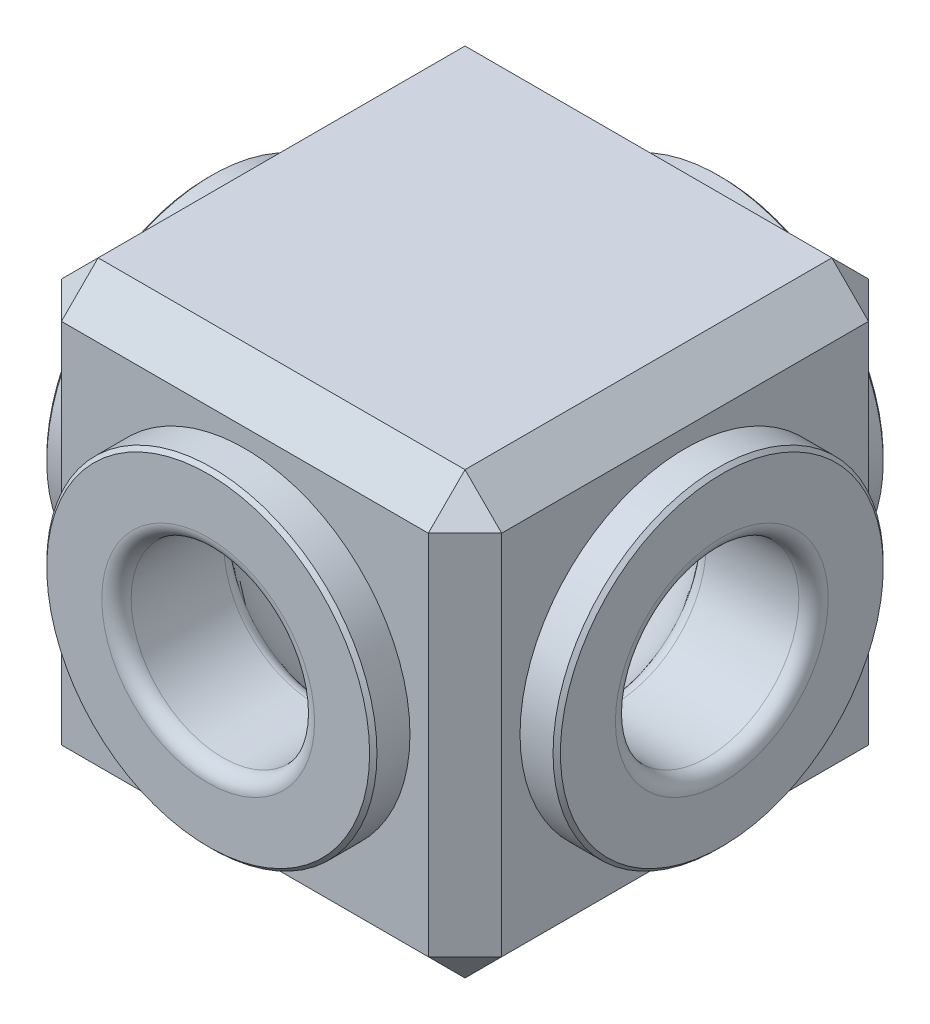
ISO-10303-21;
HEADER;
FILE_DESCRIPTION(('STEP AP214'),'2;1');
FILE_NAME('part.step','',(''),(''),'','','');
FILE_SCHEMA(('AUTOMOTIVE_DESIGN { 1 0 10303 214 1 1 1 1 }'));
ENDSEC;
DATA;
#1=APPLICATION_CONTEXT('core data for automotive mechanical design processes');
#2=APPLICATION_PROTOCOL_DEFINITION('international standard','automotive_design',2000,#1);
#3=PRODUCT_CONTEXT('',#1,'mechanical');
#4=PRODUCT('Part','Part','',(#3));
#5=PRODUCT_RELATED_PRODUCT_CATEGORY('part','',(#4));
#6=PRODUCT_DEFINITION_FORMATION('','',#4);
#7=PRODUCT_DEFINITION_CONTEXT('part definition',#1,'design');
#8=PRODUCT_DEFINITION('design','',#6,#7);
#9=PRODUCT_DEFINITION_SHAPE('','',#8);
#10=(LENGTH_UNIT() NAMED_UNIT(*) SI_UNIT(.MILLI.,.METRE.));
#11=(NAMED_UNIT(*) PLANE_ANGLE_UNIT() SI_UNIT($,.RADIAN.));
#12=(NAMED_UNIT(*) SI_UNIT($,.STERADIAN.) SOLID_ANGLE_UNIT());
#13=UNCERTAINTY_MEASURE_WITH_UNIT(LENGTH_MEASURE(1.E-05),#10,'distance_accuracy_value','');
#14=(GEOMETRIC_REPRESENTATION_CONTEXT(3) GLOBAL_UNCERTAINTY_ASSIGNED_CONTEXT((#13)) GLOBAL_UNIT_ASSIGNED_CONTEXT((#10,
#11,#12)) REPRESENTATION_CONTEXT('',''));
#15=CARTESIAN_POINT('',(0.,0.,0.));
#16=DIRECTION('',(0.,0.,1.));
#17=DIRECTION('',(1.,0.,0.));
#18=AXIS2_PLACEMENT_3D('',#15,#16,#17);
#19=CARTESIAN_POINT('',(30.,30.,30.));
#20=DIRECTION('',(-1.,0.,0.));
#21=DIRECTION('',(0.,0.,1.));
#22=AXIS2_PLACEMENT_3D('',#19,#20,#21);
#23=PLANE('',#22);
#24=DIRECTION('',(0.,-1.,0.));
#25=VECTOR('',#24,1.);
#26=CARTESIAN_POINT('',(30.,30.,25.));
#27=LINE('',#26,#25);
#28=CARTESIAN_POINT('',(30.,25.,25.));
#29=VERTEX_POINT('',#28);
#30=CARTESIAN_POINT('',(30.,-25.,25.));
#31=VERTEX_POINT('',#30);
#32=EDGE_CURVE('E193',#29,#31,#27,.T.);
#33=ORIENTED_EDGE('',*,*,#32,.T.);
#34=DIRECTION('',(0.,0.,-1.));
#35=VECTOR('',#34,1.);
#36=CARTESIAN_POINT('',(30.,-25.,-30.));
#37=LINE('',#36,#35);
#38=CARTESIAN_POINT('',(30.,-25.,-25.));
#39=VERTEX_POINT('',#38);
#40=EDGE_CURVE('E199',#31,#39,#37,.T.);
#41=ORIENTED_EDGE('',*,*,#40,.T.);
#42=DIRECTION('',(0.,1.,0.));
#43=VECTOR('',#42,1.);
#44=CARTESIAN_POINT('',(30.,30.,-25.));
#45=LINE('',#44,#43);
#46=CARTESIAN_POINT('',(30.,25.,-25.));
#47=VERTEX_POINT('',#46);
#48=EDGE_CURVE('E197',#39,#47,#45,.T.);
#49=ORIENTED_EDGE('',*,*,#48,.T.);
#50=DIRECTION('',(0.,0.,1.));
#51=VECTOR('',#50,1.);
#52=CARTESIAN_POINT('',(30.,25.,30.));
#53=LINE('',#52,#51);
#54=EDGE_CURVE('E195',#47,#29,#53,.T.);
#55=ORIENTED_EDGE('',*,*,#54,.T.);
#56=EDGE_LOOP('',(#33,#41,#49,#55));
#57=FACE_BOUND('',#56,.T.);
#58=CARTESIAN_POINT('',(30.,0.,3.14233320495882E-13));
#59=DIRECTION('',(-1.,0.,0.));
#60=DIRECTION('',(0.,0.,1.));
#61=AXIS2_PLACEMENT_3D('',#58,#59,#60);
#62=CIRCLE('',#61,22.5);
#63=CARTESIAN_POINT('',(30.,0.,22.5000000000003));
#64=VERTEX_POINT('',#63);
#65=EDGE_CURVE('E276',#64,#64,#62,.F.);
#66=ORIENTED_EDGE('',*,*,#65,.F.);
#67=EDGE_LOOP('',(#66));
#68=FACE_BOUND('',#67,.T.);
#69=ADVANCED_FACE('F34',(#57,#68),#23,.F.);
#70=CARTESIAN_POINT('',(-30.,30.,-30.));
#71=DIRECTION('',(0.,0.,1.));
#72=DIRECTION('',(1.,0.,0.));
#73=AXIS2_PLACEMENT_3D('',#70,#71,#72);
#74=PLANE('',#73);
#75=DIRECTION('',(0.,-1.,0.));
#76=VECTOR('',#75,1.);
#77=CARTESIAN_POINT('',(25.,30.,-30.));
#78=LINE('',#77,#76);
#79=CARTESIAN_POINT('',(25.,25.,-30.));
#80=VERTEX_POINT('',#79);
#81=CARTESIAN_POINT('',(25.,-25.,-30.));
#82=VERTEX_POINT('',#81);
#83=EDGE_CURVE('E127',#80,#82,#78,.T.);
#84=ORIENTED_EDGE('',*,*,#83,.T.);
#85=DIRECTION('',(-1.,0.,0.));
#86=VECTOR('',#85,1.);
#87=CARTESIAN_POINT('',(-30.,-25.,-30.));
#88=LINE('',#87,#86);
#89=CARTESIAN_POINT('',(-25.,-25.,-30.));
#90=VERTEX_POINT('',#89);
#91=EDGE_CURVE('E164',#82,#90,#88,.T.);
#92=ORIENTED_EDGE('',*,*,#91,.T.);
#93=DIRECTION('',(0.,1.,0.));
#94=VECTOR('',#93,1.);
#95=CARTESIAN_POINT('',(-25.,30.,-30.));
#96=LINE('',#95,#94);
#97=CARTESIAN_POINT('',(-25.,25.,-30.));
#98=VERTEX_POINT('',#97);
#99=EDGE_CURVE('E130',#90,#98,#96,.T.);
#100=ORIENTED_EDGE('',*,*,#99,.T.);
#101=DIRECTION('',(1.,0.,0.));
#102=VECTOR('',#101,1.);
#103=CARTESIAN_POINT('',(-30.,25.,-30.));
#104=LINE('',#103,#102);
#105=EDGE_CURVE('E121',#98,#80,#104,.T.);
#106=ORIENTED_EDGE('',*,*,#105,.T.);
#107=EDGE_LOOP('',(#84,#92,#100,#106));
#108=FACE_BOUND('',#107,.T.);
#109=CARTESIAN_POINT('',(0.,0.,-30.));
#110=DIRECTION('',(0.,0.,1.));
#111=DIRECTION('',(1.,0.,0.));
#112=AXIS2_PLACEMENT_3D('',#109,#110,#111);
#113=CIRCLE('',#112,22.5);
#114=CARTESIAN_POINT('',(22.5,0.,-30.));
#115=VERTEX_POINT('',#114);
#116=EDGE_CURVE('E271',#115,#115,#113,.F.);
#117=ORIENTED_EDGE('',*,*,#116,.F.);
#118=EDGE_LOOP('',(#117));
#119=FACE_BOUND('',#118,.T.);
#120=ADVANCED_FACE('F123',(#108,#119),#74,.F.);
#121=CARTESIAN_POINT('',(-30.,30.,30.));
#122=DIRECTION('',(1.,0.,0.));
#123=DIRECTION('',(0.,0.,-1.));
#124=AXIS2_PLACEMENT_3D('',#121,#122,#123);
#125=PLANE('',#124);
#126=DIRECTION('',(0.,-1.,0.));
#127=VECTOR('',#126,1.);
#128=CARTESIAN_POINT('',(-30.,30.,-25.));
#129=LINE('',#128,#127);
#130=CARTESIAN_POINT('',(-30.,25.,-25.));
#131=VERTEX_POINT('',#130);
#132=CARTESIAN_POINT('',(-30.,-25.,-25.));
#133=VERTEX_POINT('',#132);
#134=EDGE_CURVE('E175',#131,#133,#129,.T.);
#135=ORIENTED_EDGE('',*,*,#134,.T.);
#136=DIRECTION('',(0.,0.,1.));
#137=VECTOR('',#136,1.);
#138=CARTESIAN_POINT('',(-30.,-25.,30.));
#139=LINE('',#138,#137);
#140=CARTESIAN_POINT('',(-30.,-25.,25.));
#141=VERTEX_POINT('',#140);
#142=EDGE_CURVE('E181',#133,#141,#139,.T.);
#143=ORIENTED_EDGE('',*,*,#142,.T.);
#144=DIRECTION('',(0.,1.,0.));
#145=VECTOR('',#144,1.);
#146=CARTESIAN_POINT('',(-30.,30.,25.));
#147=LINE('',#146,#145);
#148=CARTESIAN_POINT('',(-30.,25.,25.));
#149=VERTEX_POINT('',#148);
#150=EDGE_CURVE('E179',#141,#149,#147,.T.);
#151=ORIENTED_EDGE('',*,*,#150,.T.);
#152=DIRECTION('',(0.,0.,-1.));
#153=VECTOR('',#152,1.);
#154=CARTESIAN_POINT('',(-30.,25.,30.));
#155=LINE('',#154,#153);
#156=EDGE_CURVE('E177',#149,#131,#155,.T.);
#157=ORIENTED_EDGE('',*,*,#156,.T.);
#158=EDGE_LOOP('',(#135,#143,#151,#157));
#159=FACE_BOUND('',#158,.T.);
#160=CARTESIAN_POINT('',(-30.,0.,-1.04744440165294E-13));
#161=DIRECTION('',(1.,0.,0.));
#162=DIRECTION('',(0.,0.,-1.));
#163=AXIS2_PLACEMENT_3D('',#160,#161,#162);
#164=CIRCLE('',#163,22.5);
#165=CARTESIAN_POINT('',(-30.,0.,-22.5000000000001));
#166=VERTEX_POINT('',#165);
#167=EDGE_CURVE('E266',#166,#166,#164,.F.);
#168=ORIENTED_EDGE('',*,*,#167,.F.);
#169=EDGE_LOOP('',(#168));
#170=FACE_BOUND('',#169,.T.);
#171=ADVANCED_FACE('F381',(#159,#170),#125,.F.);
#172=CARTESIAN_POINT('',(-30.,30.,30.));
#173=DIRECTION('',(0.,0.,-1.));
#174=DIRECTION('',(-1.,0.,0.));
#175=AXIS2_PLACEMENT_3D('',#172,#173,#174);
#176=PLANE('',#175);
#177=DIRECTION('',(-1.,0.,0.));
#178=VECTOR('',#177,1.);
#179=CARTESIAN_POINT('',(-30.,25.,30.));
#180=LINE('',#179,#178);
#181=CARTESIAN_POINT('',(25.,25.,30.));
#182=VERTEX_POINT('',#181);
#183=CARTESIAN_POINT('',(-25.,25.,30.));
#184=VERTEX_POINT('',#183);
#185=EDGE_CURVE('E186',#182,#184,#180,.T.);
#186=ORIENTED_EDGE('',*,*,#185,.T.);
#187=DIRECTION('',(0.,-1.,0.));
#188=VECTOR('',#187,1.);
#189=CARTESIAN_POINT('',(-25.,30.,30.));
#190=LINE('',#189,#188);
#191=CARTESIAN_POINT('',(-25.,-25.,30.));
#192=VERTEX_POINT('',#191);
#193=EDGE_CURVE('E191',#184,#192,#190,.T.);
#194=ORIENTED_EDGE('',*,*,#193,.T.);
#195=DIRECTION('',(1.,0.,0.));
#196=VECTOR('',#195,1.);
#197=CARTESIAN_POINT('',(30.,-25.,30.));
#198=LINE('',#197,#196);
#199=CARTESIAN_POINT('',(25.,-25.,30.));
#200=VERTEX_POINT('',#199);
#201=EDGE_CURVE('E188',#192,#200,#198,.T.);
#202=ORIENTED_EDGE('',*,*,#201,.T.);
#203=DIRECTION('',(0.,1.,0.));
#204=VECTOR('',#203,1.);
#205=CARTESIAN_POINT('',(25.,30.,30.));
#206=LINE('',#205,#204);
#207=EDGE_CURVE('E184',#200,#182,#206,.T.);
#208=ORIENTED_EDGE('',*,*,#207,.T.);
#209=EDGE_LOOP('',(#186,#194,#202,#208));
#210=FACE_BOUND('',#209,.T.);
#211=CARTESIAN_POINT('',(0.,0.,30.));
#212=DIRECTION('',(0.,0.,-1.));
#213=DIRECTION('',(-1.,0.,0.));
#214=AXIS2_PLACEMENT_3D('',#211,#212,#213);
#215=CIRCLE('',#214,22.5);
#216=CARTESIAN_POINT('',(-22.5,0.,30.));
#217=VERTEX_POINT('',#216);
#218=EDGE_CURVE('E260',#217,#217,#215,.F.);
#219=ORIENTED_EDGE('',*,*,#218,.F.);
#220=EDGE_LOOP('',(#219));
#221=FACE_BOUND('',#220,.T.);
#222=ADVANCED_FACE('F522',(#210,#221),#176,.F.);
#223=CARTESIAN_POINT('',(30.,30.,-30.));
#224=DIRECTION('',(0.,-1.,0.));
#225=DIRECTION('',(0.,0.,-1.));
#226=AXIS2_PLACEMENT_3D('',#223,#224,#225);
#227=PLANE('',#226);
#228=DIRECTION('',(0.,0.,1.));
#229=VECTOR('',#228,1.);
#230=CARTESIAN_POINT('',(-25.,30.,-30.));
#231=LINE('',#230,#229);
#232=CARTESIAN_POINT('',(-25.,30.,-25.));
#233=VERTEX_POINT('',#232);
#234=CARTESIAN_POINT('',(-25.,30.,25.));
#235=VERTEX_POINT('',#234);
#236=EDGE_CURVE('E43',#233,#235,#231,.T.);
#237=ORIENTED_EDGE('',*,*,#236,.T.);
#238=DIRECTION('',(1.,0.,0.));
#239=VECTOR('',#238,1.);
#240=CARTESIAN_POINT('',(30.,30.,25.));
#241=LINE('',#240,#239);
#242=CARTESIAN_POINT('',(25.,30.,25.));
#243=VERTEX_POINT('',#242);
#244=EDGE_CURVE('E11',#235,#243,#241,.T.);
#245=ORIENTED_EDGE('',*,*,#244,.T.);
#246=DIRECTION('',(0.,0.,-1.));
#247=VECTOR('',#246,1.);
#248=CARTESIAN_POINT('',(25.,30.,-30.));
#249=LINE('',#248,#247);
#250=CARTESIAN_POINT('',(25.,30.,-25.));
#251=VERTEX_POINT('',#250);
#252=EDGE_CURVE('E202',#243,#251,#249,.T.);
#253=ORIENTED_EDGE('',*,*,#252,.T.);
#254=DIRECTION('',(-1.,0.,0.));
#255=VECTOR('',#254,1.);
#256=CARTESIAN_POINT('',(30.,30.,-25.));
#257=LINE('',#256,#255);
#258=EDGE_CURVE('E54',#251,#233,#257,.T.);
#259=ORIENTED_EDGE('',*,*,#258,.T.);
#260=EDGE_LOOP('',(#237,#245,#253,#259));
#261=FACE_BOUND('',#260,.T.);
#262=ADVANCED_FACE('F502',(#261),#227,.F.);
#263=CARTESIAN_POINT('',(30.,-30.,-30.));
#264=DIRECTION('',(0.,-1.,0.));
#265=DIRECTION('',(0.,0.,-1.));
#266=AXIS2_PLACEMENT_3D('',#263,#264,#265);
#267=PLANE('',#266);
#268=DIRECTION('',(0.,0.,-1.));
#269=VECTOR('',#268,1.);
#270=CARTESIAN_POINT('',(-25.,-30.,-30.));
#271=LINE('',#270,#269);
#272=CARTESIAN_POINT('',(-25.,-30.,25.));
#273=VERTEX_POINT('',#272);
#274=CARTESIAN_POINT('',(-25.,-30.,-25.));
#275=VERTEX_POINT('',#274);
#276=EDGE_CURVE('E170',#273,#275,#271,.T.);
#277=ORIENTED_EDGE('',*,*,#276,.T.);
#278=DIRECTION('',(1.,0.,0.));
#279=VECTOR('',#278,1.);
#280=CARTESIAN_POINT('',(30.,-30.,-25.));
#281=LINE('',#280,#279);
#282=CARTESIAN_POINT('',(25.,-30.,-25.));
#283=VERTEX_POINT('',#282);
#284=EDGE_CURVE('E172',#275,#283,#281,.T.);
#285=ORIENTED_EDGE('',*,*,#284,.T.);
#286=DIRECTION('',(0.,0.,1.));
#287=VECTOR('',#286,1.);
#288=CARTESIAN_POINT('',(25.,-30.,30.));
#289=LINE('',#288,#287);
#290=CARTESIAN_POINT('',(25.,-30.,25.));
#291=VERTEX_POINT('',#290);
#292=EDGE_CURVE('E166',#283,#291,#289,.T.);
#293=ORIENTED_EDGE('',*,*,#292,.T.);
#294=DIRECTION('',(-1.,0.,0.));
#295=VECTOR('',#294,1.);
#296=CARTESIAN_POINT('',(-30.,-30.,25.));
#297=LINE('',#296,#295);
#298=EDGE_CURVE('E168',#291,#273,#297,.T.);
#299=ORIENTED_EDGE('',*,*,#298,.T.);
#300=EDGE_LOOP('',(#277,#285,#293,#299));
#301=FACE_BOUND('',#300,.T.);
#302=ADVANCED_FACE('F530',(#301),#267,.T.);
#303=CARTESIAN_POINT('',(0.,0.,-30.));
#304=DIRECTION('',(0.,0.,1.));
#305=DIRECTION('',(1.,0.,0.));
#306=AXIS2_PLACEMENT_3D('',#303,#304,#305);
#307=CYLINDRICAL_SURFACE('',#306,12.5);
#308=CARTESIAN_POINT('',(0.,0.,-20.3654118544162));
#309=DIRECTION('',(0.,0.,1.));
#310=DIRECTION('',(1.,0.,0.));
#311=AXIS2_PLACEMENT_3D('',#308,#309,#310);
#312=CIRCLE('',#311,12.5);
#313=CARTESIAN_POINT('',(12.5,0.,-20.3654118544162));
#314=VERTEX_POINT('',#313);
#315=EDGE_CURVE('E336',#314,#314,#312,.T.);
#316=ORIENTED_EDGE('',*,*,#315,.T.);
#317=EDGE_LOOP('',(#316));
#318=FACE_BOUND('',#317,.T.);
#319=CARTESIAN_POINT('',(0.,0.,-33.));
#320=DIRECTION('',(0.,0.,-1.));
#321=DIRECTION('',(-1.,0.,0.));
#322=AXIS2_PLACEMENT_3D('',#319,#320,#321);
#323=CIRCLE('',#322,12.5);
#324=CARTESIAN_POINT('',(-12.5,0.,-33.));
#325=VERTEX_POINT('',#324);
#326=EDGE_CURVE('E333',#325,#325,#323,.T.);
#327=ORIENTED_EDGE('',*,*,#326,.T.);
#328=EDGE_LOOP('',(#327));
#329=FACE_BOUND('',#328,.T.);
#330=ADVANCED_FACE('F769',(#318,#329),#307,.F.);
#331=CARTESIAN_POINT('',(0.,0.,20.3654118544162));
#332=DIRECTION('',(0.,0.,-1.));
#333=DIRECTION('',(-1.,0.,0.));
#334=AXIS2_PLACEMENT_3D('',#331,#332,#333);
#335=CIRCLE('',#334,12.5);
#336=CARTESIAN_POINT('',(-12.5,0.,20.3654118544162));
#337=VERTEX_POINT('',#336);
#338=EDGE_CURVE('E324',#337,#337,#335,.T.);
#339=ORIENTED_EDGE('',*,*,#338,.T.);
#340=EDGE_LOOP('',(#339));
#341=FACE_BOUND('',#340,.T.);
#342=CARTESIAN_POINT('',(0.,0.,33.));
#343=DIRECTION('',(0.,0.,1.));
#344=DIRECTION('',(1.,0.,0.));
#345=AXIS2_PLACEMENT_3D('',#342,#343,#344);
#346=CIRCLE('',#345,12.5);
#347=CARTESIAN_POINT('',(12.5,0.,33.));
#348=VERTEX_POINT('',#347);
#349=EDGE_CURVE('E321',#348,#348,#346,.T.);
#350=ORIENTED_EDGE('',*,*,#349,.T.);
#351=EDGE_LOOP('',(#350));
#352=FACE_BOUND('',#351,.T.);
#353=ADVANCED_FACE('F814',(#341,#352),#307,.F.);
#354=CARTESIAN_POINT('',(0.,0.,0.));
#355=DIRECTION('',(0.,-1.,0.));
#356=DIRECTION('',(0.,0.,1.));
#357=AXIS2_PLACEMENT_3D('',#354,#355,#356);
#358=SPHERICAL_SURFACE('',#357,22.9999999999999);
#359=CARTESIAN_POINT('',(18.7361789060629,0.,0.));
#360=DIRECTION('',(-1.,0.,0.));
#361=DIRECTION('',(0.,0.,1.));
#362=AXIS2_PLACEMENT_3D('',#359,#360,#361);
#363=CIRCLE('',#362,13.34);
#364=CARTESIAN_POINT('',(18.7361789060629,0.,13.34));
#365=VERTEX_POINT('',#364);
#366=EDGE_CURVE('E312',#365,#365,#363,.F.);
#367=ORIENTED_EDGE('',*,*,#366,.T.);
#368=EDGE_LOOP('',(#367));
#369=FACE_BOUND('',#368,.T.);
#370=CARTESIAN_POINT('',(0.,0.,18.7361789060629));
#371=DIRECTION('',(0.,0.,-1.));
#372=DIRECTION('',(-1.,0.,0.));
#373=AXIS2_PLACEMENT_3D('',#370,#371,#372);
#374=CIRCLE('',#373,13.34);
#375=CARTESIAN_POINT('',(-13.34,0.,18.7361789060629));
#376=VERTEX_POINT('',#375);
#377=EDGE_CURVE('E309',#376,#376,#374,.F.);
#378=ORIENTED_EDGE('',*,*,#377,.T.);
#379=EDGE_LOOP('',(#378));
#380=FACE_BOUND('',#379,.T.);
#381=CARTESIAN_POINT('',(-18.7361789060629,0.,0.));
#382=DIRECTION('',(1.,0.,0.));
#383=DIRECTION('',(0.,0.,-1.));
#384=AXIS2_PLACEMENT_3D('',#381,#382,#383);
#385=CIRCLE('',#384,13.34);
#386=CARTESIAN_POINT('',(-18.7361789060629,0.,-13.34));
#387=VERTEX_POINT('',#386);
#388=EDGE_CURVE('E306',#387,#387,#385,.F.);
#389=ORIENTED_EDGE('',*,*,#388,.T.);
#390=EDGE_LOOP('',(#389));
#391=FACE_BOUND('',#390,.T.);
#392=CARTESIAN_POINT('',(0.,0.,-18.7361789060629));
#393=DIRECTION('',(0.,0.,1.));
#394=DIRECTION('',(1.,0.,0.));
#395=AXIS2_PLACEMENT_3D('',#392,#393,#394);
#396=CIRCLE('',#395,13.34);
#397=CARTESIAN_POINT('',(13.34,0.,-18.7361789060629));
#398=VERTEX_POINT('',#397);
#399=EDGE_CURVE('E303',#398,#398,#396,.F.);
#400=ORIENTED_EDGE('',*,*,#399,.T.);
#401=EDGE_LOOP('',(#400));
#402=FACE_BOUND('',#401,.T.);
#403=ADVANCED_FACE('F371',(#369,#380,#391,#402),#358,.F.);
#404=CARTESIAN_POINT('',(-30.,0.,0.));
#405=DIRECTION('',(1.,0.,0.));
#406=DIRECTION('',(0.,0.,-1.));
#407=AXIS2_PLACEMENT_3D('',#404,#405,#406);
#408=CYLINDRICAL_SURFACE('',#407,12.5);
#409=CARTESIAN_POINT('',(-20.3654118544162,0.,0.));
#410=DIRECTION('',(1.,0.,0.));
#411=DIRECTION('',(0.,0.,-1.));
#412=AXIS2_PLACEMENT_3D('',#409,#410,#411);
#413=CIRCLE('',#412,12.5);
#414=CARTESIAN_POINT('',(-20.3654118544162,0.,-12.5));
#415=VERTEX_POINT('',#414);
#416=EDGE_CURVE('E330',#415,#415,#413,.T.);
#417=ORIENTED_EDGE('',*,*,#416,.T.);
#418=EDGE_LOOP('',(#417));
#419=FACE_BOUND('',#418,.T.);
#420=CARTESIAN_POINT('',(-33.,0.,0.));
#421=DIRECTION('',(-1.,0.,0.));
#422=DIRECTION('',(0.,0.,1.));
#423=AXIS2_PLACEMENT_3D('',#420,#421,#422);
#424=CIRCLE('',#423,12.5);
#425=CARTESIAN_POINT('',(-33.,0.,12.5));
#426=VERTEX_POINT('',#425);
#427=EDGE_CURVE('E327',#426,#426,#424,.T.);
#428=ORIENTED_EDGE('',*,*,#427,.T.);
#429=EDGE_LOOP('',(#428));
#430=FACE_BOUND('',#429,.T.);
#431=ADVANCED_FACE('F361',(#419,#430),#408,.F.);
#432=CARTESIAN_POINT('',(20.3654118544162,0.,0.));
#433=DIRECTION('',(-1.,0.,0.));
#434=DIRECTION('',(0.,0.,1.));
#435=AXIS2_PLACEMENT_3D('',#432,#433,#434);
#436=CIRCLE('',#435,12.5);
#437=CARTESIAN_POINT('',(20.3654118544162,0.,12.5));
#438=VERTEX_POINT('',#437);
#439=EDGE_CURVE('E318',#438,#438,#436,.T.);
#440=ORIENTED_EDGE('',*,*,#439,.T.);
#441=EDGE_LOOP('',(#440));
#442=FACE_BOUND('',#441,.T.);
#443=CARTESIAN_POINT('',(33.,0.,0.));
#444=DIRECTION('',(1.,0.,0.));
#445=DIRECTION('',(0.,0.,-1.));
#446=AXIS2_PLACEMENT_3D('',#443,#444,#445);
#447=CIRCLE('',#446,12.5);
#448=CARTESIAN_POINT('',(33.0000000000002,0.,-12.5));
#449=VERTEX_POINT('',#448);
#450=EDGE_CURVE('E315',#449,#449,#447,.T.);
#451=ORIENTED_EDGE('',*,*,#450,.T.);
#452=EDGE_LOOP('',(#451));
#453=FACE_BOUND('',#452,.T.);
#454=ADVANCED_FACE('F358',(#442,#453),#408,.F.);
#455=CARTESIAN_POINT('',(0.,0.,35.));
#456=DIRECTION('',(0.,0.,1.));
#457=DIRECTION('',(1.,0.,0.));
#458=AXIS2_PLACEMENT_3D('',#455,#456,#457);
#459=PLANE('',#458);
#460=CARTESIAN_POINT('',(0.,0.,35.));
#461=DIRECTION('',(0.,0.,1.));
#462=DIRECTION('',(1.,0.,0.));
#463=AXIS2_PLACEMENT_3D('',#460,#461,#462);
#464=CIRCLE('',#463,14.5);
#465=CARTESIAN_POINT('',(14.5,0.,35.));
#466=VERTEX_POINT('',#465);
#467=EDGE_CURVE('E156',#466,#466,#464,.F.);
#468=ORIENTED_EDGE('',*,*,#467,.T.);
#469=EDGE_LOOP('',(#468));
#470=FACE_BOUND('',#469,.T.);
#471=CARTESIAN_POINT('',(0.,0.,35.));
#472=DIRECTION('',(0.,0.,1.));
#473=DIRECTION('',(1.,0.,0.));
#474=AXIS2_PLACEMENT_3D('',#471,#472,#473);
#475=CIRCLE('',#474,22.);
#476=CARTESIAN_POINT('',(22.,0.,35.));
#477=VERTEX_POINT('',#476);
#478=EDGE_CURVE('E297',#477,#477,#475,.T.);
#479=ORIENTED_EDGE('',*,*,#478,.T.);
#480=EDGE_LOOP('',(#479));
#481=FACE_BOUND('',#480,.T.);
#482=ADVANCED_FACE('F360',(#470,#481),#459,.T.);
#483=CARTESIAN_POINT('',(0.,0.,35.));
#484=DIRECTION('',(0.,0.,-1.));
#485=DIRECTION('',(-1.,0.,0.));
#486=AXIS2_PLACEMENT_3D('',#483,#484,#485);
#487=CYLINDRICAL_SURFACE('',#486,22.5);
#488=CARTESIAN_POINT('',(0.,0.,34.5));
#489=DIRECTION('',(0.,0.,1.));
#490=DIRECTION('',(1.,0.,0.));
#491=AXIS2_PLACEMENT_3D('',#488,#489,#490);
#492=CIRCLE('',#491,22.5);
#493=CARTESIAN_POINT('',(22.5,0.,34.5));
#494=VERTEX_POINT('',#493);
#495=EDGE_CURVE('E300',#494,#494,#492,.F.);
#496=ORIENTED_EDGE('',*,*,#495,.T.);
#497=EDGE_LOOP('',(#496));
#498=FACE_BOUND('',#497,.T.);
#499=ORIENTED_EDGE('',*,*,#218,.T.);
#500=EDGE_LOOP('',(#499));
#501=FACE_BOUND('',#500,.T.);
#502=ADVANCED_FACE('F368',(#498,#501),#487,.T.);
#503=CARTESIAN_POINT('',(-35.,0.,-1.2220184685951E-13));
#504=DIRECTION('',(-1.,0.,0.));
#505=DIRECTION('',(0.,0.,1.));
#506=AXIS2_PLACEMENT_3D('',#503,#504,#505);
#507=PLANE('',#506);
#508=CARTESIAN_POINT('',(-35.,0.,0.));
#509=DIRECTION('',(-1.,0.,0.));
#510=DIRECTION('',(0.,0.,1.));
#511=AXIS2_PLACEMENT_3D('',#508,#509,#510);
#512=CIRCLE('',#511,14.5);
#513=CARTESIAN_POINT('',(-35.,0.,14.5));
#514=VERTEX_POINT('',#513);
#515=EDGE_CURVE('E339',#514,#514,#512,.F.);
#516=ORIENTED_EDGE('',*,*,#515,.T.);
#517=EDGE_LOOP('',(#516));
#518=FACE_BOUND('',#517,.T.);
#519=CARTESIAN_POINT('',(-35.,0.,-1.2220184685951E-13));
#520=DIRECTION('',(-1.,0.,0.));
#521=DIRECTION('',(0.,0.,1.));
#522=AXIS2_PLACEMENT_3D('',#519,#520,#521);
#523=CIRCLE('',#522,22.);
#524=CARTESIAN_POINT('',(-35.0000000000001,0.,21.9999999999999));
#525=VERTEX_POINT('',#524);
#526=EDGE_CURVE('E279',#525,#525,#523,.T.);
#527=ORIENTED_EDGE('',*,*,#526,.T.);
#528=EDGE_LOOP('',(#527));
#529=FACE_BOUND('',#528,.T.);
#530=ADVANCED_FACE('F541',(#518,#529),#507,.T.);
#531=CARTESIAN_POINT('',(-35.,0.,-1.2220184685951E-13));
#532=DIRECTION('',(1.,0.,0.));
#533=DIRECTION('',(0.,0.,-1.));
#534=AXIS2_PLACEMENT_3D('',#531,#532,#533);
#535=CYLINDRICAL_SURFACE('',#534,22.5);
#536=CARTESIAN_POINT('',(-34.5,0.,-1.20456106190088E-13));
#537=DIRECTION('',(-1.,0.,0.));
#538=DIRECTION('',(0.,0.,1.));
#539=AXIS2_PLACEMENT_3D('',#536,#537,#538);
#540=CIRCLE('',#539,22.5);
#541=CARTESIAN_POINT('',(-34.5,0.,22.4999999999999));
#542=VERTEX_POINT('',#541);
#543=EDGE_CURVE('E282',#542,#542,#540,.F.);
#544=ORIENTED_EDGE('',*,*,#543,.T.);
#545=EDGE_LOOP('',(#544));
#546=FACE_BOUND('',#545,.T.);
#547=ORIENTED_EDGE('',*,*,#167,.T.);
#548=EDGE_LOOP('',(#547));
#549=FACE_BOUND('',#548,.T.);
#550=ADVANCED_FACE('F538',(#546,#549),#535,.T.);
#551=CARTESIAN_POINT('',(0.,0.,-35.));
#552=DIRECTION('',(0.,0.,-1.));
#553=DIRECTION('',(-1.,0.,0.));
#554=AXIS2_PLACEMENT_3D('',#551,#552,#553);
#555=PLANE('',#554);
#556=CARTESIAN_POINT('',(0.,0.,-35.));
#557=DIRECTION('',(0.,0.,-1.));
#558=DIRECTION('',(-1.,0.,0.));
#559=AXIS2_PLACEMENT_3D('',#556,#557,#558);
#560=CIRCLE('',#559,14.5);
#561=CARTESIAN_POINT('',(-14.5,0.,-35.));
#562=VERTEX_POINT('',#561);
#563=EDGE_CURVE('E342',#562,#562,#560,.F.);
#564=ORIENTED_EDGE('',*,*,#563,.T.);
#565=EDGE_LOOP('',(#564));
#566=FACE_BOUND('',#565,.T.);
#567=CARTESIAN_POINT('',(0.,0.,-35.));
#568=DIRECTION('',(0.,0.,-1.));
#569=DIRECTION('',(-1.,0.,0.));
#570=AXIS2_PLACEMENT_3D('',#567,#568,#569);
#571=CIRCLE('',#570,22.);
#572=CARTESIAN_POINT('',(-22.,0.,-35.));
#573=VERTEX_POINT('',#572);
#574=EDGE_CURVE('E285',#573,#573,#571,.T.);
#575=ORIENTED_EDGE('',*,*,#574,.T.);
#576=EDGE_LOOP('',(#575));
#577=FACE_BOUND('',#576,.T.);
#578=ADVANCED_FACE('F540',(#566,#577),#555,.T.);
#579=CARTESIAN_POINT('',(0.,0.,-35.));
#580=DIRECTION('',(0.,0.,1.));
#581=DIRECTION('',(1.,0.,0.));
#582=AXIS2_PLACEMENT_3D('',#579,#580,#581);
#583=CYLINDRICAL_SURFACE('',#582,22.5);
#584=CARTESIAN_POINT('',(0.,0.,-34.5));
#585=DIRECTION('',(0.,0.,-1.));
#586=DIRECTION('',(-1.,0.,0.));
#587=AXIS2_PLACEMENT_3D('',#584,#585,#586);
#588=CIRCLE('',#587,22.5);
#589=CARTESIAN_POINT('',(-22.5,0.,-34.5));
#590=VERTEX_POINT('',#589);
#591=EDGE_CURVE('E288',#590,#590,#588,.F.);
#592=ORIENTED_EDGE('',*,*,#591,.T.);
#593=EDGE_LOOP('',(#592));
#594=FACE_BOUND('',#593,.T.);
#595=ORIENTED_EDGE('',*,*,#116,.T.);
#596=EDGE_LOOP('',(#595));
#597=FACE_BOUND('',#596,.T.);
#598=ADVANCED_FACE('F548',(#594,#597),#583,.T.);
#599=CARTESIAN_POINT('',(35.,0.,3.66605540578529E-13));
#600=DIRECTION('',(1.,0.,0.));
#601=DIRECTION('',(0.,0.,-1.));
#602=AXIS2_PLACEMENT_3D('',#599,#600,#601);
#603=PLANE('',#602);
#604=CARTESIAN_POINT('',(35.,0.,0.));
#605=DIRECTION('',(1.,0.,0.));
#606=DIRECTION('',(0.,0.,-1.));
#607=AXIS2_PLACEMENT_3D('',#604,#605,#606);
#608=CIRCLE('',#607,14.5);
#609=CARTESIAN_POINT('',(35.0000000000002,0.,-14.5));
#610=VERTEX_POINT('',#609);
#611=EDGE_CURVE('E159',#610,#610,#608,.F.);
#612=ORIENTED_EDGE('',*,*,#611,.T.);
#613=EDGE_LOOP('',(#612));
#614=FACE_BOUND('',#613,.T.);
#615=CARTESIAN_POINT('',(35.,0.,3.66605540578529E-13));
#616=DIRECTION('',(1.,0.,0.));
#617=DIRECTION('',(0.,0.,-1.));
#618=AXIS2_PLACEMENT_3D('',#615,#616,#617);
#619=CIRCLE('',#618,22.);
#620=CARTESIAN_POINT('',(35.0000000000002,0.,-21.9999999999996));
#621=VERTEX_POINT('',#620);
#622=EDGE_CURVE('E291',#621,#621,#619,.T.);
#623=ORIENTED_EDGE('',*,*,#622,.T.);
#624=EDGE_LOOP('',(#623));
#625=FACE_BOUND('',#624,.T.);
#626=ADVANCED_FACE('F347',(#614,#625),#603,.T.);
#627=CARTESIAN_POINT('',(35.,0.,3.66605540578529E-13));
#628=DIRECTION('',(-1.,0.,0.));
#629=DIRECTION('',(0.,0.,1.));
#630=AXIS2_PLACEMENT_3D('',#627,#628,#629);
#631=CYLINDRICAL_SURFACE('',#630,22.5);
#632=CARTESIAN_POINT('',(34.5,0.,3.61368318570265E-13));
#633=DIRECTION('',(1.,0.,0.));
#634=DIRECTION('',(0.,0.,-1.));
#635=AXIS2_PLACEMENT_3D('',#632,#633,#634);
#636=CIRCLE('',#635,22.5);
#637=CARTESIAN_POINT('',(34.5000000000003,0.,-22.4999999999996));
#638=VERTEX_POINT('',#637);
#639=EDGE_CURVE('E294',#638,#638,#636,.F.);
#640=ORIENTED_EDGE('',*,*,#639,.T.);
#641=EDGE_LOOP('',(#640));
#642=FACE_BOUND('',#641,.T.);
#643=ORIENTED_EDGE('',*,*,#65,.T.);
#644=EDGE_LOOP('',(#643));
#645=FACE_BOUND('',#644,.T.);
#646=ADVANCED_FACE('F390',(#642,#645),#631,.T.);
#647=CARTESIAN_POINT('',(-35.,0.,-1.2220184685951E-13));
#648=DIRECTION('',(1.,0.,0.));
#649=DIRECTION('',(0.,0.,-1.));
#650=AXIS2_PLACEMENT_3D('',#647,#648,#649);
#651=CONICAL_SURFACE('',#650,22.,0.785398163397441);
#652=ORIENTED_EDGE('',*,*,#543,.F.);
#653=EDGE_LOOP('',(#652));
#654=FACE_BOUND('',#653,.T.);
#655=ORIENTED_EDGE('',*,*,#526,.F.);
#656=EDGE_LOOP('',(#655));
#657=FACE_BOUND('',#656,.T.);
#658=ADVANCED_FACE('F386',(#654,#657),#651,.T.);
#659=CARTESIAN_POINT('',(0.,0.,-35.));
#660=DIRECTION('',(0.,0.,1.));
#661=DIRECTION('',(1.,0.,0.));
#662=AXIS2_PLACEMENT_3D('',#659,#660,#661);
#663=CONICAL_SURFACE('',#662,22.,0.785398163397459);
#664=ORIENTED_EDGE('',*,*,#591,.F.);
#665=EDGE_LOOP('',(#664));
#666=FACE_BOUND('',#665,.T.);
#667=ORIENTED_EDGE('',*,*,#574,.F.);
#668=EDGE_LOOP('',(#667));
#669=FACE_BOUND('',#668,.T.);
#670=ADVANCED_FACE('F389',(#666,#669),#663,.T.);
#671=CARTESIAN_POINT('',(35.,0.,3.66605540578529E-13));
#672=DIRECTION('',(-1.,0.,0.));
#673=DIRECTION('',(0.,0.,1.));
#674=AXIS2_PLACEMENT_3D('',#671,#672,#673);
#675=CONICAL_SURFACE('',#674,22.,0.785398163397455);
#676=ORIENTED_EDGE('',*,*,#639,.F.);
#677=EDGE_LOOP('',(#676));
#678=FACE_BOUND('',#677,.T.);
#679=ORIENTED_EDGE('',*,*,#622,.F.);
#680=EDGE_LOOP('',(#679));
#681=FACE_BOUND('',#680,.T.);
#682=ADVANCED_FACE('F394',(#678,#681),#675,.T.);
#683=CARTESIAN_POINT('',(0.,0.,35.));
#684=DIRECTION('',(0.,0.,-1.));
#685=DIRECTION('',(-1.,0.,0.));
#686=AXIS2_PLACEMENT_3D('',#683,#684,#685);
#687=CONICAL_SURFACE('',#686,22.,0.785398163397459);
#688=ORIENTED_EDGE('',*,*,#495,.F.);
#689=EDGE_LOOP('',(#688));
#690=FACE_BOUND('',#689,.T.);
#691=ORIENTED_EDGE('',*,*,#478,.F.);
#692=EDGE_LOOP('',(#691));
#693=FACE_BOUND('',#692,.T.);
#694=ADVANCED_FACE('F398',(#690,#693),#687,.T.);
#695=CARTESIAN_POINT('',(20.3654118544162,0.,0.));
#696=DIRECTION('',(-1.,0.,0.));
#697=DIRECTION('',(0.,0.,1.));
#698=AXIS2_PLACEMENT_3D('',#695,#696,#697);
#699=TOROIDAL_SURFACE('',#698,14.5,2.);
#700=ORIENTED_EDGE('',*,*,#439,.F.);
#701=EDGE_LOOP('',(#700));
#702=FACE_BOUND('',#701,.T.);
#703=ORIENTED_EDGE('',*,*,#366,.F.);
#704=EDGE_LOOP('',(#703));
#705=FACE_BOUND('',#704,.T.);
#706=ADVANCED_FACE('F402',(#702,#705),#699,.T.);
#707=CARTESIAN_POINT('',(0.,0.,20.3654118544162));
#708=DIRECTION('',(0.,0.,-1.));
#709=DIRECTION('',(-1.,0.,0.));
#710=AXIS2_PLACEMENT_3D('',#707,#708,#709);
#711=TOROIDAL_SURFACE('',#710,14.5,2.);
#712=ORIENTED_EDGE('',*,*,#338,.F.);
#713=EDGE_LOOP('',(#712));
#714=FACE_BOUND('',#713,.T.);
#715=ORIENTED_EDGE('',*,*,#377,.F.);
#716=EDGE_LOOP('',(#715));
#717=FACE_BOUND('',#716,.T.);
#718=ADVANCED_FACE('F406',(#714,#717),#711,.T.);
#719=CARTESIAN_POINT('',(-20.3654118544162,0.,0.));
#720=DIRECTION('',(1.,0.,0.));
#721=DIRECTION('',(0.,0.,-1.));
#722=AXIS2_PLACEMENT_3D('',#719,#720,#721);
#723=TOROIDAL_SURFACE('',#722,14.5,2.);
#724=ORIENTED_EDGE('',*,*,#416,.F.);
#725=EDGE_LOOP('',(#724));
#726=FACE_BOUND('',#725,.T.);
#727=ORIENTED_EDGE('',*,*,#388,.F.);
#728=EDGE_LOOP('',(#727));
#729=FACE_BOUND('',#728,.T.);
#730=ADVANCED_FACE('F410',(#726,#729),#723,.T.);
#731=CARTESIAN_POINT('',(0.,0.,-20.3654118544162));
#732=DIRECTION('',(0.,0.,1.));
#733=DIRECTION('',(1.,0.,0.));
#734=AXIS2_PLACEMENT_3D('',#731,#732,#733);
#735=TOROIDAL_SURFACE('',#734,14.5,2.);
#736=ORIENTED_EDGE('',*,*,#315,.F.);
#737=EDGE_LOOP('',(#736));
#738=FACE_BOUND('',#737,.T.);
#739=ORIENTED_EDGE('',*,*,#399,.F.);
#740=EDGE_LOOP('',(#739));
#741=FACE_BOUND('',#740,.T.);
#742=ADVANCED_FACE('F414',(#738,#741),#735,.T.);
#743=CARTESIAN_POINT('',(-33.,0.,0.));
#744=DIRECTION('',(-1.,0.,0.));
#745=DIRECTION('',(0.,0.,1.));
#746=AXIS2_PLACEMENT_3D('',#743,#744,#745);
#747=TOROIDAL_SURFACE('',#746,14.5,2.);
#748=ORIENTED_EDGE('',*,*,#515,.F.);
#749=EDGE_LOOP('',(#748));
#750=FACE_BOUND('',#749,.T.);
#751=ORIENTED_EDGE('',*,*,#427,.F.);
#752=EDGE_LOOP('',(#751));
#753=FACE_BOUND('',#752,.T.);
#754=ADVANCED_FACE('F418',(#750,#753),#747,.T.);
#755=CARTESIAN_POINT('',(0.,0.,-33.));
#756=DIRECTION('',(0.,0.,-1.));
#757=DIRECTION('',(-1.,0.,0.));
#758=AXIS2_PLACEMENT_3D('',#755,#756,#757);
#759=TOROIDAL_SURFACE('',#758,14.5,2.);
#760=ORIENTED_EDGE('',*,*,#563,.F.);
#761=EDGE_LOOP('',(#760));
#762=FACE_BOUND('',#761,.T.);
#763=ORIENTED_EDGE('',*,*,#326,.F.);
#764=EDGE_LOOP('',(#763));
#765=FACE_BOUND('',#764,.T.);
#766=ADVANCED_FACE('F354',(#762,#765),#759,.T.);
#767=CARTESIAN_POINT('',(33.,0.,0.));
#768=DIRECTION('',(1.,0.,0.));
#769=DIRECTION('',(0.,0.,-1.));
#770=AXIS2_PLACEMENT_3D('',#767,#768,#769);
#771=TOROIDAL_SURFACE('',#770,14.5,2.);
#772=ORIENTED_EDGE('',*,*,#611,.F.);
#773=EDGE_LOOP('',(#772));
#774=FACE_BOUND('',#773,.T.);
#775=ORIENTED_EDGE('',*,*,#450,.F.);
#776=EDGE_LOOP('',(#775));
#777=FACE_BOUND('',#776,.T.);
#778=ADVANCED_FACE('F350',(#774,#777),#771,.T.);
#779=CARTESIAN_POINT('',(0.,0.,33.));
#780=DIRECTION('',(0.,0.,1.));
#781=DIRECTION('',(1.,0.,0.));
#782=AXIS2_PLACEMENT_3D('',#779,#780,#781);
#783=TOROIDAL_SURFACE('',#782,14.5,2.);
#784=ORIENTED_EDGE('',*,*,#467,.F.);
#785=EDGE_LOOP('',(#784));
#786=FACE_BOUND('',#785,.T.);
#787=ORIENTED_EDGE('',*,*,#349,.F.);
#788=EDGE_LOOP('',(#787));
#789=FACE_BOUND('',#788,.T.);
#790=ADVANCED_FACE('F353',(#786,#789),#783,.T.);
#791=CARTESIAN_POINT('',(30.,30.,25.));
#792=DIRECTION('',(0.,-0.707106781186546,-0.707106781186548));
#793=DIRECTION('',(0.,0.707106781186549,-0.707106781186547));
#794=AXIS2_PLACEMENT_3D('',#791,#792,#793);
#795=PLANE('',#794);
#796=DIRECTION('',(0.,0.707106781186548,-0.707106781186547));
#797=VECTOR('',#796,1.);
#798=CARTESIAN_POINT('',(25.,30.,25.));
#799=LINE('',#798,#797);
#800=EDGE_CURVE('E38',#243,#182,#799,.F.);
#801=ORIENTED_EDGE('',*,*,#800,.F.);
#802=ORIENTED_EDGE('',*,*,#244,.F.);
#803=DIRECTION('',(0.,-0.707106781186548,0.707106781186546));
#804=VECTOR('',#803,1.);
#805=CARTESIAN_POINT('',(-25.,25.,30.));
#806=LINE('',#805,#804);
#807=EDGE_CURVE('E253',#184,#235,#806,.F.);
#808=ORIENTED_EDGE('',*,*,#807,.F.);
#809=ORIENTED_EDGE('',*,*,#185,.F.);
#810=EDGE_LOOP('',(#801,#802,#808,#809));
#811=FACE_BOUND('',#810,.T.);
#812=ADVANCED_FACE('F36',(#811),#795,.F.);
#813=CARTESIAN_POINT('',(25.,30.,25.));
#814=DIRECTION('',(0.577350269189624,0.577350269189626,0.577350269189627));
#815=DIRECTION('',(0.,-0.707106781186549,0.707106781186547));
#816=AXIS2_PLACEMENT_3D('',#813,#814,#815);
#817=PLANE('',#816);
#818=DIRECTION('',(0.707106781186548,-0.707106781186546,0.));
#819=VECTOR('',#818,1.);
#820=CARTESIAN_POINT('',(25.,30.,25.));
#821=LINE('',#820,#819);
#822=EDGE_CURVE('E248',#243,#29,#821,.T.);
#823=ORIENTED_EDGE('',*,*,#822,.F.);
#824=ORIENTED_EDGE('',*,*,#800,.T.);
#825=DIRECTION('',(-0.707106781186548,0.,0.707106781186546));
#826=VECTOR('',#825,1.);
#827=CARTESIAN_POINT('',(27.5,25.,27.5));
#828=LINE('',#827,#826);
#829=EDGE_CURVE('E251',#29,#182,#828,.T.);
#830=ORIENTED_EDGE('',*,*,#829,.F.);
#831=EDGE_LOOP('',(#823,#824,#830));
#832=FACE_BOUND('',#831,.T.);
#833=ADVANCED_FACE('F493',(#832),#817,.T.);
#834=CARTESIAN_POINT('',(-25.,25.,30.));
#835=DIRECTION('',(-0.577350269189626,0.577350269189624,0.577350269189627));
#836=DIRECTION('',(0.707106781186549,0.,0.707106781186547));
#837=AXIS2_PLACEMENT_3D('',#834,#835,#836);
#838=PLANE('',#837);
#839=DIRECTION('',(-0.707106781186548,0.,-0.707106781186547));
#840=VECTOR('',#839,1.);
#841=CARTESIAN_POINT('',(-25.,25.,30.));
#842=LINE('',#841,#840);
#843=EDGE_CURVE('E242',#184,#149,#842,.T.);
#844=ORIENTED_EDGE('',*,*,#843,.F.);
#845=ORIENTED_EDGE('',*,*,#807,.T.);
#846=DIRECTION('',(0.707106781186546,0.707106781186548,0.));
#847=VECTOR('',#846,1.);
#848=CARTESIAN_POINT('',(-27.5,27.5,25.));
#849=LINE('',#848,#847);
#850=EDGE_CURVE('E245',#149,#235,#849,.T.);
#851=ORIENTED_EDGE('',*,*,#850,.F.);
#852=EDGE_LOOP('',(#844,#845,#851));
#853=FACE_BOUND('',#852,.T.);
#854=ADVANCED_FACE('F490',(#853),#838,.T.);
#855=CARTESIAN_POINT('',(30.,30.,25.));
#856=DIRECTION('',(-0.707106781186546,0.,-0.707106781186548));
#857=DIRECTION('',(-0.707106781186549,0.,0.707106781186547));
#858=AXIS2_PLACEMENT_3D('',#855,#856,#857);
#859=PLANE('',#858);
#860=ORIENTED_EDGE('',*,*,#829,.T.);
#861=ORIENTED_EDGE('',*,*,#207,.F.);
#862=DIRECTION('',(0.707106781186548,0.,-0.707106781186546));
#863=VECTOR('',#862,1.);
#864=CARTESIAN_POINT('',(25.,-25.,30.));
#865=LINE('',#864,#863);
#866=EDGE_CURVE('E237',#31,#200,#865,.F.);
#867=ORIENTED_EDGE('',*,*,#866,.F.);
#868=ORIENTED_EDGE('',*,*,#32,.F.);
#869=EDGE_LOOP('',(#860,#861,#867,#868));
#870=FACE_BOUND('',#869,.T.);
#871=ADVANCED_FACE('F486',(#870),#859,.F.);
#872=CARTESIAN_POINT('',(25.,30.,-30.));
#873=DIRECTION('',(-0.707106781186546,-0.707106781186548,0.));
#874=DIRECTION('',(0.707106781186549,-0.707106781186547,0.));
#875=AXIS2_PLACEMENT_3D('',#872,#873,#874);
#876=PLANE('',#875);
#877=ORIENTED_EDGE('',*,*,#822,.T.);
#878=ORIENTED_EDGE('',*,*,#54,.F.);
#879=DIRECTION('',(-0.707106781186548,0.707106781186546,0.));
#880=VECTOR('',#879,1.);
#881=CARTESIAN_POINT('',(27.5,27.5,-25.));
#882=LINE('',#881,#880);
#883=EDGE_CURVE('E142',#251,#47,#882,.F.);
#884=ORIENTED_EDGE('',*,*,#883,.F.);
#885=ORIENTED_EDGE('',*,*,#252,.F.);
#886=EDGE_LOOP('',(#877,#878,#884,#885));
#887=FACE_BOUND('',#886,.T.);
#888=ADVANCED_FACE('F483',(#887),#876,.F.);
#889=CARTESIAN_POINT('',(30.,30.,-25.));
#890=DIRECTION('',(0.,-0.707106781186546,0.707106781186548));
#891=DIRECTION('',(0.,-0.707106781186549,-0.707106781186547));
#892=AXIS2_PLACEMENT_3D('',#889,#890,#891);
#893=PLANE('',#892);
#894=DIRECTION('',(0.,0.707106781186548,0.707106781186546));
#895=VECTOR('',#894,1.);
#896=CARTESIAN_POINT('',(-25.,27.5,-27.5));
#897=LINE('',#896,#895);
#898=EDGE_CURVE('E143',#233,#98,#897,.F.);
#899=ORIENTED_EDGE('',*,*,#898,.F.);
#900=ORIENTED_EDGE('',*,*,#258,.F.);
#901=DIRECTION('',(0.,-0.707106781186548,-0.707106781186547));
#902=VECTOR('',#901,1.);
#903=CARTESIAN_POINT('',(25.,25.,-30.));
#904=LINE('',#903,#902);
#905=EDGE_CURVE('E136',#80,#251,#904,.F.);
#906=ORIENTED_EDGE('',*,*,#905,.F.);
#907=ORIENTED_EDGE('',*,*,#105,.F.);
#908=EDGE_LOOP('',(#899,#900,#906,#907));
#909=FACE_BOUND('',#908,.T.);
#910=ADVANCED_FACE('F138',(#909),#893,.F.);
#911=CARTESIAN_POINT('',(-25.,30.,-30.));
#912=DIRECTION('',(0.707106781186548,-0.707106781186546,0.));
#913=DIRECTION('',(0.707106781186547,0.707106781186549,0.));
#914=AXIS2_PLACEMENT_3D('',#911,#912,#913);
#915=PLANE('',#914);
#916=ORIENTED_EDGE('',*,*,#850,.T.);
#917=ORIENTED_EDGE('',*,*,#236,.F.);
#918=DIRECTION('',(-0.707106781186546,-0.707106781186548,0.));
#919=VECTOR('',#918,1.);
#920=CARTESIAN_POINT('',(-30.,25.,-25.));
#921=LINE('',#920,#919);
#922=EDGE_CURVE('E232',#131,#233,#921,.F.);
#923=ORIENTED_EDGE('',*,*,#922,.F.);
#924=ORIENTED_EDGE('',*,*,#156,.F.);
#925=EDGE_LOOP('',(#916,#917,#923,#924));
#926=FACE_BOUND('',#925,.T.);
#927=ADVANCED_FACE('F476',(#926),#915,.F.);
#928=CARTESIAN_POINT('',(-25.,30.,30.));
#929=DIRECTION('',(0.707106781186546,0.,-0.707106781186548));
#930=DIRECTION('',(-0.707106781186549,0.,-0.707106781186547));
#931=AXIS2_PLACEMENT_3D('',#928,#929,#930);
#932=PLANE('',#931);
#933=ORIENTED_EDGE('',*,*,#843,.T.);
#934=ORIENTED_EDGE('',*,*,#150,.F.);
#935=DIRECTION('',(0.707106781186548,0.,0.707106781186546));
#936=VECTOR('',#935,1.);
#937=CARTESIAN_POINT('',(-30.,-25.,25.));
#938=LINE('',#937,#936);
#939=EDGE_CURVE('E229',#192,#141,#938,.F.);
#940=ORIENTED_EDGE('',*,*,#939,.F.);
#941=ORIENTED_EDGE('',*,*,#193,.F.);
#942=EDGE_LOOP('',(#933,#934,#940,#941));
#943=FACE_BOUND('',#942,.T.);
#944=ADVANCED_FACE('F472',(#943),#932,.F.);
#945=CARTESIAN_POINT('',(-30.,-25.,30.));
#946=DIRECTION('',(0.,-0.707106781186546,0.707106781186548));
#947=DIRECTION('',(0.,-0.707106781186549,-0.707106781186547));
#948=AXIS2_PLACEMENT_3D('',#945,#946,#947);
#949=PLANE('',#948);
#950=DIRECTION('',(0.,-0.707106781186548,-0.707106781186547));
#951=VECTOR('',#950,1.);
#952=CARTESIAN_POINT('',(25.,-25.,30.));
#953=LINE('',#952,#951);
#954=EDGE_CURVE('E239',#200,#291,#953,.T.);
#955=ORIENTED_EDGE('',*,*,#954,.F.);
#956=ORIENTED_EDGE('',*,*,#201,.F.);
#957=DIRECTION('',(0.,0.707106781186548,0.707106781186547));
#958=VECTOR('',#957,1.);
#959=CARTESIAN_POINT('',(-25.,-27.5,27.5));
#960=LINE('',#959,#958);
#961=EDGE_CURVE('E226',#273,#192,#960,.T.);
#962=ORIENTED_EDGE('',*,*,#961,.F.);
#963=ORIENTED_EDGE('',*,*,#298,.F.);
#964=EDGE_LOOP('',(#955,#956,#962,#963));
#965=FACE_BOUND('',#964,.T.);
#966=ADVANCED_FACE('F468',(#965),#949,.T.);
#967=CARTESIAN_POINT('',(25.,-25.,30.));
#968=DIRECTION('',(0.577350269189624,-0.577350269189626,0.577350269189627));
#969=DIRECTION('',(0.,-0.707106781186549,-0.707106781186547));
#970=AXIS2_PLACEMENT_3D('',#967,#968,#969);
#971=PLANE('',#970);
#972=ORIENTED_EDGE('',*,*,#866,.T.);
#973=ORIENTED_EDGE('',*,*,#954,.T.);
#974=DIRECTION('',(0.707106781186548,0.707106781186546,0.));
#975=VECTOR('',#974,1.);
#976=CARTESIAN_POINT('',(27.5,-27.5,25.));
#977=LINE('',#976,#975);
#978=EDGE_CURVE('E150',#31,#291,#977,.F.);
#979=ORIENTED_EDGE('',*,*,#978,.F.);
#980=EDGE_LOOP('',(#972,#973,#979));
#981=FACE_BOUND('',#980,.T.);
#982=ADVANCED_FACE('F465',(#981),#971,.T.);
#983=CARTESIAN_POINT('',(25.,25.,-30.));
#984=DIRECTION('',(0.577350269189624,0.577350269189626,-0.577350269189627));
#985=DIRECTION('',(0.,0.707106781186549,0.707106781186547));
#986=AXIS2_PLACEMENT_3D('',#983,#984,#985);
#987=PLANE('',#986);
#988=ORIENTED_EDGE('',*,*,#905,.T.);
#989=ORIENTED_EDGE('',*,*,#883,.T.);
#990=DIRECTION('',(0.707106781186548,0.,0.707106781186546));
#991=VECTOR('',#990,1.);
#992=CARTESIAN_POINT('',(25.,25.,-30.));
#993=LINE('',#992,#991);
#994=EDGE_CURVE('E146',#80,#47,#993,.T.);
#995=ORIENTED_EDGE('',*,*,#994,.F.);
#996=EDGE_LOOP('',(#988,#989,#995));
#997=FACE_BOUND('',#996,.T.);
#998=ADVANCED_FACE('F147',(#997),#987,.T.);
#999=CARTESIAN_POINT('',(-30.,25.,-25.));
#1000=DIRECTION('',(-0.577350269189626,0.577350269189624,-0.577350269189627));
#1001=DIRECTION('',(-0.707106781186549,0.,0.707106781186547));
#1002=AXIS2_PLACEMENT_3D('',#999,#1000,#1001);
#1003=PLANE('',#1002);
#1004=ORIENTED_EDGE('',*,*,#922,.T.);
#1005=ORIENTED_EDGE('',*,*,#898,.T.);
#1006=DIRECTION('',(0.707106781186548,0.,-0.707106781186547));
#1007=VECTOR('',#1006,1.);
#1008=CARTESIAN_POINT('',(-30.,25.,-25.));
#1009=LINE('',#1008,#1007);
#1010=EDGE_CURVE('E151',#131,#98,#1009,.T.);
#1011=ORIENTED_EDGE('',*,*,#1010,.F.);
#1012=EDGE_LOOP('',(#1004,#1005,#1011));
#1013=FACE_BOUND('',#1012,.T.);
#1014=ADVANCED_FACE('F458',(#1013),#1003,.T.);
#1015=CARTESIAN_POINT('',(-30.,-25.,25.));
#1016=DIRECTION('',(-0.577350269189624,-0.577350269189626,0.577350269189627));
#1017=DIRECTION('',(0.,-0.707106781186548,-0.707106781186547));
#1018=AXIS2_PLACEMENT_3D('',#1015,#1016,#1017);
#1019=PLANE('',#1018);
#1020=ORIENTED_EDGE('',*,*,#961,.T.);
#1021=ORIENTED_EDGE('',*,*,#939,.T.);
#1022=DIRECTION('',(0.707106781186548,-0.707106781186546,0.));
#1023=VECTOR('',#1022,1.);
#1024=CARTESIAN_POINT('',(-30.,-25.,25.));
#1025=LINE('',#1024,#1023);
#1026=EDGE_CURVE('E220',#273,#141,#1025,.F.);
#1027=ORIENTED_EDGE('',*,*,#1026,.F.);
#1028=EDGE_LOOP('',(#1020,#1021,#1027));
#1029=FACE_BOUND('',#1028,.T.);
#1030=ADVANCED_FACE('F454',(#1029),#1019,.T.);
#1031=CARTESIAN_POINT('',(30.,-25.,30.));
#1032=DIRECTION('',(0.707106781186546,-0.707106781186548,0.));
#1033=DIRECTION('',(0.707106781186549,0.707106781186547,0.));
#1034=AXIS2_PLACEMENT_3D('',#1031,#1032,#1033);
#1035=PLANE('',#1034);
#1036=ORIENTED_EDGE('',*,*,#978,.T.);
#1037=ORIENTED_EDGE('',*,*,#292,.F.);
#1038=DIRECTION('',(-0.707106781186548,-0.707106781186546,0.));
#1039=VECTOR('',#1038,1.);
#1040=CARTESIAN_POINT('',(25.,-30.,-25.));
#1041=LINE('',#1040,#1039);
#1042=EDGE_CURVE('E217',#39,#283,#1041,.T.);
#1043=ORIENTED_EDGE('',*,*,#1042,.F.);
#1044=ORIENTED_EDGE('',*,*,#40,.F.);
#1045=EDGE_LOOP('',(#1036,#1037,#1043,#1044));
#1046=FACE_BOUND('',#1045,.T.);
#1047=ADVANCED_FACE('F451',(#1046),#1035,.T.);
#1048=CARTESIAN_POINT('',(25.,30.,-30.));
#1049=DIRECTION('',(-0.707106781186546,0.,0.707106781186548));
#1050=DIRECTION('',(0.707106781186549,0.,0.707106781186547));
#1051=AXIS2_PLACEMENT_3D('',#1048,#1049,#1050);
#1052=PLANE('',#1051);
#1053=ORIENTED_EDGE('',*,*,#994,.T.);
#1054=ORIENTED_EDGE('',*,*,#48,.F.);
#1055=DIRECTION('',(-0.707106781186548,0.,-0.707106781186546));
#1056=VECTOR('',#1055,1.);
#1057=CARTESIAN_POINT('',(27.5,-25.,-27.5));
#1058=LINE('',#1057,#1056);
#1059=EDGE_CURVE('E154',#82,#39,#1058,.F.);
#1060=ORIENTED_EDGE('',*,*,#1059,.F.);
#1061=ORIENTED_EDGE('',*,*,#83,.F.);
#1062=EDGE_LOOP('',(#1053,#1054,#1060,#1061));
#1063=FACE_BOUND('',#1062,.T.);
#1064=ADVANCED_FACE('F153',(#1063),#1052,.F.);
#1065=CARTESIAN_POINT('',(-30.,30.,-25.));
#1066=DIRECTION('',(0.707106781186546,0.,0.707106781186548));
#1067=DIRECTION('',(0.707106781186549,0.,-0.707106781186547));
#1068=AXIS2_PLACEMENT_3D('',#1065,#1066,#1067);
#1069=PLANE('',#1068);
#1070=ORIENTED_EDGE('',*,*,#1010,.T.);
#1071=ORIENTED_EDGE('',*,*,#99,.F.);
#1072=DIRECTION('',(-0.707106781186548,0.,0.707106781186546));
#1073=VECTOR('',#1072,1.);
#1074=CARTESIAN_POINT('',(-25.,-25.,-30.));
#1075=LINE('',#1074,#1073);
#1076=EDGE_CURVE('E213',#133,#90,#1075,.F.);
#1077=ORIENTED_EDGE('',*,*,#1076,.F.);
#1078=ORIENTED_EDGE('',*,*,#134,.F.);
#1079=EDGE_LOOP('',(#1070,#1071,#1077,#1078));
#1080=FACE_BOUND('',#1079,.T.);
#1081=ADVANCED_FACE('F444',(#1080),#1069,.F.);
#1082=CARTESIAN_POINT('',(-30.,-25.,30.));
#1083=DIRECTION('',(-0.707106781186546,-0.707106781186548,0.));
#1084=DIRECTION('',(0.707106781186549,-0.707106781186547,0.));
#1085=AXIS2_PLACEMENT_3D('',#1082,#1083,#1084);
#1086=PLANE('',#1085);
#1087=ORIENTED_EDGE('',*,*,#1026,.T.);
#1088=ORIENTED_EDGE('',*,*,#142,.F.);
#1089=DIRECTION('',(-0.707106781186548,0.707106781186546,0.));
#1090=VECTOR('',#1089,1.);
#1091=CARTESIAN_POINT('',(-27.5,-27.5,-25.));
#1092=LINE('',#1091,#1090);
#1093=EDGE_CURVE('E210',#275,#133,#1092,.T.);
#1094=ORIENTED_EDGE('',*,*,#1093,.F.);
#1095=ORIENTED_EDGE('',*,*,#276,.F.);
#1096=EDGE_LOOP('',(#1087,#1088,#1094,#1095));
#1097=FACE_BOUND('',#1096,.T.);
#1098=ADVANCED_FACE('F440',(#1097),#1086,.T.);
#1099=CARTESIAN_POINT('',(25.,-30.,-25.));
#1100=DIRECTION('',(0.577350269189624,-0.577350269189627,-0.577350269189626));
#1101=DIRECTION('',(0.,0.707106781186547,-0.707106781186549));
#1102=AXIS2_PLACEMENT_3D('',#1099,#1100,#1101);
#1103=PLANE('',#1102);
#1104=ORIENTED_EDGE('',*,*,#1059,.T.);
#1105=ORIENTED_EDGE('',*,*,#1042,.T.);
#1106=DIRECTION('',(0.,0.707106781186547,-0.707106781186548));
#1107=VECTOR('',#1106,1.);
#1108=CARTESIAN_POINT('',(25.,-30.,-25.));
#1109=LINE('',#1108,#1107);
#1110=EDGE_CURVE('E208',#82,#283,#1109,.F.);
#1111=ORIENTED_EDGE('',*,*,#1110,.F.);
#1112=EDGE_LOOP('',(#1104,#1105,#1111));
#1113=FACE_BOUND('',#1112,.T.);
#1114=ADVANCED_FACE('F436',(#1113),#1103,.T.);
#1115=CARTESIAN_POINT('',(-25.,-25.,-30.));
#1116=DIRECTION('',(-0.577350269189624,-0.577350269189627,-0.577350269189626));
#1117=DIRECTION('',(0.,0.707106781186547,-0.707106781186549));
#1118=AXIS2_PLACEMENT_3D('',#1115,#1116,#1117);
#1119=PLANE('',#1118);
#1120=ORIENTED_EDGE('',*,*,#1093,.T.);
#1121=ORIENTED_EDGE('',*,*,#1076,.T.);
#1122=DIRECTION('',(0.,-0.707106781186547,0.707106781186548));
#1123=VECTOR('',#1122,1.);
#1124=CARTESIAN_POINT('',(-25.,-25.,-30.));
#1125=LINE('',#1124,#1123);
#1126=EDGE_CURVE('E206',#275,#90,#1125,.F.);
#1127=ORIENTED_EDGE('',*,*,#1126,.F.);
#1128=EDGE_LOOP('',(#1120,#1121,#1127));
#1129=FACE_BOUND('',#1128,.T.);
#1130=ADVANCED_FACE('F432',(#1129),#1119,.T.);
#1131=CARTESIAN_POINT('',(-30.,-25.,-30.));
#1132=DIRECTION('',(0.,-0.707106781186548,-0.707106781186546));
#1133=DIRECTION('',(0.,0.707106781186547,-0.707106781186549));
#1134=AXIS2_PLACEMENT_3D('',#1131,#1132,#1133);
#1135=PLANE('',#1134);
#1136=ORIENTED_EDGE('',*,*,#1110,.T.);
#1137=ORIENTED_EDGE('',*,*,#284,.F.);
#1138=ORIENTED_EDGE('',*,*,#1126,.T.);
#1139=ORIENTED_EDGE('',*,*,#91,.F.);
#1140=EDGE_LOOP('',(#1136,#1137,#1138,#1139));
#1141=FACE_BOUND('',#1140,.T.);
#1142=ADVANCED_FACE('F429',(#1141),#1135,.T.);
#1143=CLOSED_SHELL('',(#69,#120,#171,#222,#262,#302,#330,#353,#403,#431,#454,#482,#502,#530,
#550,#578,#598,#626,#646,#658,#670,#682,#694,#706,#718,#730,#742,#754,#766,#778,#790,#812,#833,
#854,#871,#888,#910,#927,#944,#966,#982,#998,#1014,#1030,#1047,#1064,#1081,#1098,#1114,#1130,#1142));
#1144=MANIFOLD_SOLID_BREP('B2',#1143);
#1145=ADVANCED_BREP_SHAPE_REPRESENTATION('',(#18,#1144),#14);
#1146=SHAPE_DEFINITION_REPRESENTATION(#9,#1145);
ENDSEC;
END-ISO-10303-21;
